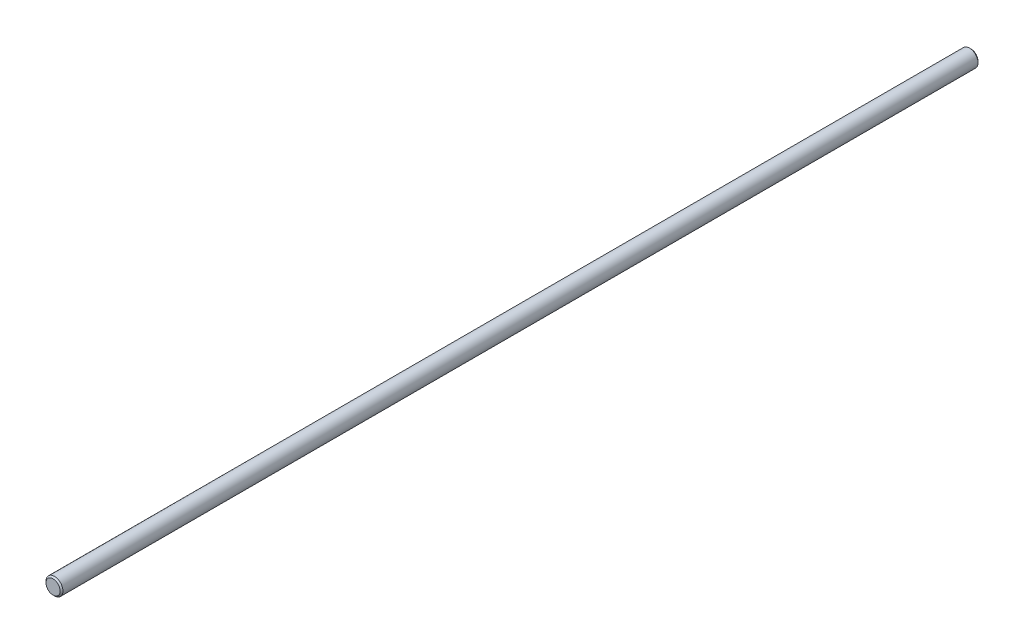
ISO-10303-21;
HEADER;
FILE_DESCRIPTION(('STEP AP214'),'2;1');
FILE_NAME('part.step','',(''),(''),'','','');
FILE_SCHEMA(('AUTOMOTIVE_DESIGN { 1 0 10303 214 1 1 1 1 }'));
ENDSEC;
DATA;
#1=APPLICATION_CONTEXT('core data for automotive mechanical design processes');
#2=APPLICATION_PROTOCOL_DEFINITION('international standard','automotive_design',2000,#1);
#3=PRODUCT_CONTEXT('',#1,'mechanical');
#4=PRODUCT('Part','Part','',(#3));
#5=PRODUCT_RELATED_PRODUCT_CATEGORY('part','',(#4));
#6=PRODUCT_DEFINITION_FORMATION('','',#4);
#7=PRODUCT_DEFINITION_CONTEXT('part definition',#1,'design');
#8=PRODUCT_DEFINITION('design','',#6,#7);
#9=PRODUCT_DEFINITION_SHAPE('','',#8);
#10=(LENGTH_UNIT() NAMED_UNIT(*) SI_UNIT(.MILLI.,.METRE.));
#11=(NAMED_UNIT(*) PLANE_ANGLE_UNIT() SI_UNIT($,.RADIAN.));
#12=(NAMED_UNIT(*) SI_UNIT($,.STERADIAN.) SOLID_ANGLE_UNIT());
#13=UNCERTAINTY_MEASURE_WITH_UNIT(LENGTH_MEASURE(1.E-05),#10,'distance_accuracy_value','');
#14=(GEOMETRIC_REPRESENTATION_CONTEXT(3) GLOBAL_UNCERTAINTY_ASSIGNED_CONTEXT((#13)) GLOBAL_UNIT_ASSIGNED_CONTEXT((#10,
#11,#12)) REPRESENTATION_CONTEXT('',''));
#15=CARTESIAN_POINT('',(0.,0.,0.));
#16=DIRECTION('',(0.,0.,1.));
#17=DIRECTION('',(1.,0.,0.));
#18=AXIS2_PLACEMENT_3D('',#15,#16,#17);
#19=CARTESIAN_POINT('',(0.,0.,325.));
#20=DIRECTION('',(0.,0.,-1.));
#21=DIRECTION('',(-1.,0.,0.));
#22=AXIS2_PLACEMENT_3D('',#19,#20,#21);
#23=CYLINDRICAL_SURFACE('',#22,6.);
#24=CARTESIAN_POINT('',(0.,0.,324.));
#25=DIRECTION('',(0.,0.,1.));
#26=DIRECTION('',(1.,0.,0.));
#27=AXIS2_PLACEMENT_3D('',#24,#25,#26);
#28=CIRCLE('',#27,6.);
#29=CARTESIAN_POINT('',(6.,0.,324.));
#30=VERTEX_POINT('',#29);
#31=EDGE_CURVE('E56',#30,#30,#28,.F.);
#32=ORIENTED_EDGE('',*,*,#31,.T.);
#33=EDGE_LOOP('',(#32));
#34=FACE_BOUND('',#33,.T.);
#35=CARTESIAN_POINT('',(0.,0.,-324.));
#36=DIRECTION('',(0.,0.,1.));
#37=DIRECTION('',(1.,0.,0.));
#38=AXIS2_PLACEMENT_3D('',#35,#36,#37);
#39=CIRCLE('',#38,6.);
#40=CARTESIAN_POINT('',(6.,0.,-324.));
#41=VERTEX_POINT('',#40);
#42=EDGE_CURVE('E61',#41,#41,#39,.T.);
#43=ORIENTED_EDGE('',*,*,#42,.T.);
#44=EDGE_LOOP('',(#43));
#45=FACE_BOUND('',#44,.T.);
#46=ADVANCED_FACE('F47',(#34,#45),#23,.T.);
#47=CARTESIAN_POINT('',(0.,0.,325.));
#48=DIRECTION('',(0.,0.,1.));
#49=DIRECTION('',(1.,0.,0.));
#50=AXIS2_PLACEMENT_3D('',#47,#48,#49);
#51=PLANE('',#50);
#52=CARTESIAN_POINT('',(0.,0.,325.));
#53=DIRECTION('',(0.,0.,1.));
#54=DIRECTION('',(1.,0.,0.));
#55=AXIS2_PLACEMENT_3D('',#52,#53,#54);
#56=CIRCLE('',#55,5.);
#57=CARTESIAN_POINT('',(5.,0.,325.));
#58=VERTEX_POINT('',#57);
#59=EDGE_CURVE('E66',#58,#58,#56,.T.);
#60=ORIENTED_EDGE('',*,*,#59,.T.);
#61=EDGE_LOOP('',(#60));
#62=FACE_BOUND('',#61,.T.);
#63=ADVANCED_FACE('F73',(#62),#51,.T.);
#64=CARTESIAN_POINT('',(0.,0.,-325.));
#65=DIRECTION('',(0.,0.,1.));
#66=DIRECTION('',(1.,0.,0.));
#67=AXIS2_PLACEMENT_3D('',#64,#65,#66);
#68=PLANE('',#67);
#69=CARTESIAN_POINT('',(0.,0.,-325.));
#70=DIRECTION('',(0.,0.,1.));
#71=DIRECTION('',(1.,0.,0.));
#72=AXIS2_PLACEMENT_3D('',#69,#70,#71);
#73=CIRCLE('',#72,4.99999999999984);
#74=CARTESIAN_POINT('',(4.99999999999984,0.,-325.));
#75=VERTEX_POINT('',#74);
#76=EDGE_CURVE('E10',#75,#75,#73,.F.);
#77=ORIENTED_EDGE('',*,*,#76,.T.);
#78=EDGE_LOOP('',(#77));
#79=FACE_BOUND('',#78,.T.);
#80=ADVANCED_FACE('F77',(#79),#68,.F.);
#81=CARTESIAN_POINT('',(0.,0.,325.));
#82=DIRECTION('',(0.,0.,-1.));
#83=DIRECTION('',(-1.,0.,0.));
#84=AXIS2_PLACEMENT_3D('',#81,#82,#83);
#85=CONICAL_SURFACE('',#84,5.,0.785398163397474);
#86=ORIENTED_EDGE('',*,*,#31,.F.);
#87=EDGE_LOOP('',(#86));
#88=FACE_BOUND('',#87,.T.);
#89=ORIENTED_EDGE('',*,*,#59,.F.);
#90=EDGE_LOOP('',(#89));
#91=FACE_BOUND('',#90,.T.);
#92=ADVANCED_FACE('F75',(#88,#91),#85,.T.);
#93=CARTESIAN_POINT('',(0.,0.,-324.));
#94=DIRECTION('',(0.,0.,1.));
#95=DIRECTION('',(1.,0.,0.));
#96=AXIS2_PLACEMENT_3D('',#93,#94,#95);
#97=CONICAL_SURFACE('',#96,6.,0.785398163397418);
#98=ORIENTED_EDGE('',*,*,#76,.F.);
#99=EDGE_LOOP('',(#98));
#100=FACE_BOUND('',#99,.T.);
#101=ORIENTED_EDGE('',*,*,#42,.F.);
#102=EDGE_LOOP('',(#101));
#103=FACE_BOUND('',#102,.T.);
#104=ADVANCED_FACE('F50',(#100,#103),#97,.T.);
#105=CLOSED_SHELL('',(#46,#63,#80,#92,#104));
#106=MANIFOLD_SOLID_BREP('B2',#105);
#107=ADVANCED_BREP_SHAPE_REPRESENTATION('',(#18,#106),#14);
#108=SHAPE_DEFINITION_REPRESENTATION(#9,#107);
ENDSEC;
END-ISO-10303-21;
